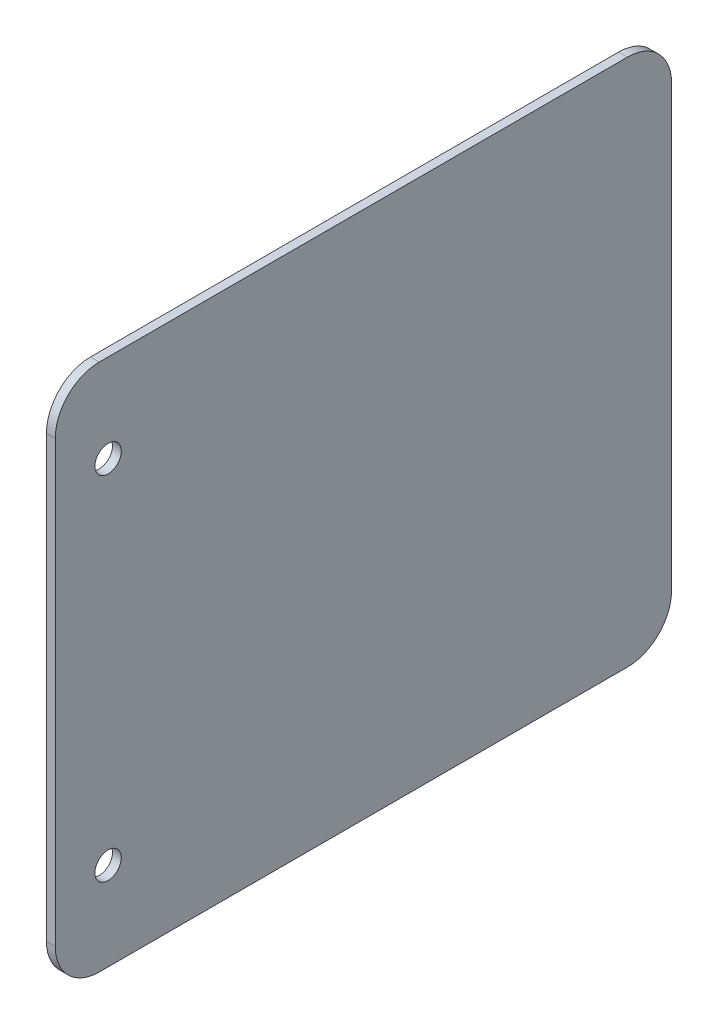
ISO-10303-21;
HEADER;
FILE_DESCRIPTION(('STEP AP214'),'2;1');
FILE_NAME('part.step','',(''),(''),'','','');
FILE_SCHEMA(('AUTOMOTIVE_DESIGN { 1 0 10303 214 1 1 1 1 }'));
ENDSEC;
DATA;
#1=APPLICATION_CONTEXT('core data for automotive mechanical design processes');
#2=APPLICATION_PROTOCOL_DEFINITION('international standard','automotive_design',2000,#1);
#3=PRODUCT_CONTEXT('',#1,'mechanical');
#4=PRODUCT('Part','Part','',(#3));
#5=PRODUCT_RELATED_PRODUCT_CATEGORY('part','',(#4));
#6=PRODUCT_DEFINITION_FORMATION('','',#4);
#7=PRODUCT_DEFINITION_CONTEXT('part definition',#1,'design');
#8=PRODUCT_DEFINITION('design','',#6,#7);
#9=PRODUCT_DEFINITION_SHAPE('','',#8);
#10=(LENGTH_UNIT() NAMED_UNIT(*) SI_UNIT(.MILLI.,.METRE.));
#11=(NAMED_UNIT(*) PLANE_ANGLE_UNIT() SI_UNIT($,.RADIAN.));
#12=(NAMED_UNIT(*) SI_UNIT($,.STERADIAN.) SOLID_ANGLE_UNIT());
#13=UNCERTAINTY_MEASURE_WITH_UNIT(LENGTH_MEASURE(1.E-05),#10,'distance_accuracy_value','');
#14=(GEOMETRIC_REPRESENTATION_CONTEXT(3) GLOBAL_UNCERTAINTY_ASSIGNED_CONTEXT((#13)) GLOBAL_UNIT_ASSIGNED_CONTEXT((#10,
#11,#12)) REPRESENTATION_CONTEXT('',''));
#15=CARTESIAN_POINT('',(0.,0.,0.));
#16=DIRECTION('',(0.,0.,1.));
#17=DIRECTION('',(1.,0.,0.));
#18=AXIS2_PLACEMENT_3D('',#15,#16,#17);
#19=CARTESIAN_POINT('',(-1.,-25.,30.));
#20=DIRECTION('',(1.,0.,0.));
#21=DIRECTION('',(0.,0.,-1.));
#22=AXIS2_PLACEMENT_3D('',#19,#20,#21);
#23=CYLINDRICAL_SURFACE('',#22,5.00000000000001);
#24=CARTESIAN_POINT('',(0.,-25.,30.));
#25=DIRECTION('',(1.,0.,0.));
#26=DIRECTION('',(0.,0.,-1.));
#27=AXIS2_PLACEMENT_3D('',#24,#25,#26);
#28=CIRCLE('',#27,5.00000000000001);
#29=CARTESIAN_POINT('',(0.,-25.,35.));
#30=VERTEX_POINT('',#29);
#31=CARTESIAN_POINT('',(0.,-30.,30.));
#32=VERTEX_POINT('',#31);
#33=EDGE_CURVE('E130',#30,#32,#28,.T.);
#34=ORIENTED_EDGE('',*,*,#33,.F.);
#35=DIRECTION('',(1.,0.,0.));
#36=VECTOR('',#35,1.);
#37=CARTESIAN_POINT('',(-1.,-25.,35.));
#38=LINE('',#37,#36);
#39=CARTESIAN_POINT('',(-1.,-25.,35.));
#40=VERTEX_POINT('',#39);
#41=EDGE_CURVE('E11',#40,#30,#38,.T.);
#42=ORIENTED_EDGE('',*,*,#41,.F.);
#43=CARTESIAN_POINT('',(-1.,-25.,30.));
#44=DIRECTION('',(1.,0.,0.));
#45=DIRECTION('',(0.,0.,-1.));
#46=AXIS2_PLACEMENT_3D('',#43,#44,#45);
#47=CIRCLE('',#46,5.00000000000001);
#48=CARTESIAN_POINT('',(-1.,-30.,30.));
#49=VERTEX_POINT('',#48);
#50=EDGE_CURVE('E151',#40,#49,#47,.T.);
#51=ORIENTED_EDGE('',*,*,#50,.T.);
#52=DIRECTION('',(1.,0.,0.));
#53=VECTOR('',#52,1.);
#54=CARTESIAN_POINT('',(-1.,-30.,30.));
#55=LINE('',#54,#53);
#56=EDGE_CURVE('E36',#49,#32,#55,.T.);
#57=ORIENTED_EDGE('',*,*,#56,.T.);
#58=EDGE_LOOP('',(#34,#42,#51,#57));
#59=FACE_BOUND('',#58,.T.);
#60=ADVANCED_FACE('F33',(#59),#23,.T.);
#61=CARTESIAN_POINT('',(-1.,25.,35.));
#62=DIRECTION('',(0.,0.,1.));
#63=DIRECTION('',(1.,0.,0.));
#64=AXIS2_PLACEMENT_3D('',#61,#62,#63);
#65=PLANE('',#64);
#66=DIRECTION('',(0.,-1.,0.));
#67=VECTOR('',#66,1.);
#68=CARTESIAN_POINT('',(0.,25.,35.));
#69=LINE('',#68,#67);
#70=CARTESIAN_POINT('',(0.,25.,35.));
#71=VERTEX_POINT('',#70);
#72=EDGE_CURVE('E149',#71,#30,#69,.T.);
#73=ORIENTED_EDGE('',*,*,#72,.F.);
#74=DIRECTION('',(1.,0.,0.));
#75=VECTOR('',#74,1.);
#76=CARTESIAN_POINT('',(-1.,25.,35.));
#77=LINE('',#76,#75);
#78=CARTESIAN_POINT('',(-1.,25.,35.));
#79=VERTEX_POINT('',#78);
#80=EDGE_CURVE('E42',#79,#71,#77,.T.);
#81=ORIENTED_EDGE('',*,*,#80,.F.);
#82=DIRECTION('',(0.,-1.,0.));
#83=VECTOR('',#82,1.);
#84=CARTESIAN_POINT('',(-1.,25.,35.));
#85=LINE('',#84,#83);
#86=EDGE_CURVE('E120',#79,#40,#85,.T.);
#87=ORIENTED_EDGE('',*,*,#86,.T.);
#88=ORIENTED_EDGE('',*,*,#41,.T.);
#89=EDGE_LOOP('',(#73,#81,#87,#88));
#90=FACE_BOUND('',#89,.T.);
#91=ADVANCED_FACE('F163',(#90),#65,.T.);
#92=CARTESIAN_POINT('',(-1.,25.,30.));
#93=DIRECTION('',(1.,0.,0.));
#94=DIRECTION('',(0.,0.,-1.));
#95=AXIS2_PLACEMENT_3D('',#92,#93,#94);
#96=CYLINDRICAL_SURFACE('',#95,5.);
#97=CARTESIAN_POINT('',(0.,25.,30.));
#98=DIRECTION('',(1.,0.,0.));
#99=DIRECTION('',(0.,0.,-1.));
#100=AXIS2_PLACEMENT_3D('',#97,#98,#99);
#101=CIRCLE('',#100,5.);
#102=CARTESIAN_POINT('',(0.,30.,30.));
#103=VERTEX_POINT('',#102);
#104=EDGE_CURVE('E107',#103,#71,#101,.T.);
#105=ORIENTED_EDGE('',*,*,#104,.F.);
#106=DIRECTION('',(1.,0.,0.));
#107=VECTOR('',#106,1.);
#108=CARTESIAN_POINT('',(-1.,30.,30.));
#109=LINE('',#108,#107);
#110=CARTESIAN_POINT('',(-1.,30.,30.));
#111=VERTEX_POINT('',#110);
#112=EDGE_CURVE('E102',#111,#103,#109,.T.);
#113=ORIENTED_EDGE('',*,*,#112,.F.);
#114=CARTESIAN_POINT('',(-1.,25.,30.));
#115=DIRECTION('',(1.,0.,0.));
#116=DIRECTION('',(0.,0.,-1.));
#117=AXIS2_PLACEMENT_3D('',#114,#115,#116);
#118=CIRCLE('',#117,5.);
#119=EDGE_CURVE('E105',#111,#79,#118,.T.);
#120=ORIENTED_EDGE('',*,*,#119,.T.);
#121=ORIENTED_EDGE('',*,*,#80,.T.);
#122=EDGE_LOOP('',(#105,#113,#120,#121));
#123=FACE_BOUND('',#122,.T.);
#124=ADVANCED_FACE('F104',(#123),#96,.T.);
#125=CARTESIAN_POINT('',(-1.,30.,30.));
#126=DIRECTION('',(0.,1.,0.));
#127=DIRECTION('',(0.,0.,1.));
#128=AXIS2_PLACEMENT_3D('',#125,#126,#127);
#129=PLANE('',#128);
#130=DIRECTION('',(0.,0.,1.));
#131=VECTOR('',#130,1.);
#132=CARTESIAN_POINT('',(0.,30.,30.));
#133=LINE('',#132,#131);
#134=CARTESIAN_POINT('',(0.,30.,-30.));
#135=VERTEX_POINT('',#134);
#136=EDGE_CURVE('E146',#135,#103,#133,.T.);
#137=ORIENTED_EDGE('',*,*,#136,.F.);
#138=DIRECTION('',(1.,0.,0.));
#139=VECTOR('',#138,1.);
#140=CARTESIAN_POINT('',(-1.,30.,-30.));
#141=LINE('',#140,#139);
#142=CARTESIAN_POINT('',(-1.,30.,-30.));
#143=VERTEX_POINT('',#142);
#144=EDGE_CURVE('E112',#143,#135,#141,.T.);
#145=ORIENTED_EDGE('',*,*,#144,.F.);
#146=DIRECTION('',(0.,0.,1.));
#147=VECTOR('',#146,1.);
#148=CARTESIAN_POINT('',(-1.,30.,30.));
#149=LINE('',#148,#147);
#150=EDGE_CURVE('E118',#143,#111,#149,.T.);
#151=ORIENTED_EDGE('',*,*,#150,.T.);
#152=ORIENTED_EDGE('',*,*,#112,.T.);
#153=EDGE_LOOP('',(#137,#145,#151,#152));
#154=FACE_BOUND('',#153,.T.);
#155=ADVANCED_FACE('F122',(#154),#129,.T.);
#156=CARTESIAN_POINT('',(-1.,25.,-30.));
#157=DIRECTION('',(1.,0.,0.));
#158=DIRECTION('',(0.,0.,-1.));
#159=AXIS2_PLACEMENT_3D('',#156,#157,#158);
#160=CYLINDRICAL_SURFACE('',#159,5.);
#161=CARTESIAN_POINT('',(0.,25.,-30.));
#162=DIRECTION('',(1.,0.,0.));
#163=DIRECTION('',(0.,0.,-1.));
#164=AXIS2_PLACEMENT_3D('',#161,#162,#163);
#165=CIRCLE('',#164,5.);
#166=CARTESIAN_POINT('',(0.,25.,-35.));
#167=VERTEX_POINT('',#166);
#168=EDGE_CURVE('E143',#167,#135,#165,.T.);
#169=ORIENTED_EDGE('',*,*,#168,.F.);
#170=DIRECTION('',(1.,0.,0.));
#171=VECTOR('',#170,1.);
#172=CARTESIAN_POINT('',(-1.,25.,-35.));
#173=LINE('',#172,#171);
#174=CARTESIAN_POINT('',(-1.,25.,-35.));
#175=VERTEX_POINT('',#174);
#176=EDGE_CURVE('E155',#175,#167,#173,.T.);
#177=ORIENTED_EDGE('',*,*,#176,.F.);
#178=CARTESIAN_POINT('',(-1.,25.,-30.));
#179=DIRECTION('',(1.,0.,0.));
#180=DIRECTION('',(0.,0.,-1.));
#181=AXIS2_PLACEMENT_3D('',#178,#179,#180);
#182=CIRCLE('',#181,5.);
#183=EDGE_CURVE('E123',#175,#143,#182,.T.);
#184=ORIENTED_EDGE('',*,*,#183,.T.);
#185=ORIENTED_EDGE('',*,*,#144,.T.);
#186=EDGE_LOOP('',(#169,#177,#184,#185));
#187=FACE_BOUND('',#186,.T.);
#188=ADVANCED_FACE('F176',(#187),#160,.T.);
#189=CARTESIAN_POINT('',(-1.,25.,-35.));
#190=DIRECTION('',(0.,0.,-1.));
#191=DIRECTION('',(0.,1.,0.));
#192=AXIS2_PLACEMENT_3D('',#189,#190,#191);
#193=PLANE('',#192);
#194=DIRECTION('',(0.,1.,0.));
#195=VECTOR('',#194,1.);
#196=CARTESIAN_POINT('',(0.,25.,-35.));
#197=LINE('',#196,#195);
#198=CARTESIAN_POINT('',(0.,-25.,-35.));
#199=VERTEX_POINT('',#198);
#200=EDGE_CURVE('E140',#199,#167,#197,.T.);
#201=ORIENTED_EDGE('',*,*,#200,.F.);
#202=DIRECTION('',(1.,0.,0.));
#203=VECTOR('',#202,1.);
#204=CARTESIAN_POINT('',(-1.,-25.,-35.));
#205=LINE('',#204,#203);
#206=CARTESIAN_POINT('',(-1.,-25.,-35.));
#207=VERTEX_POINT('',#206);
#208=EDGE_CURVE('E157',#207,#199,#205,.T.);
#209=ORIENTED_EDGE('',*,*,#208,.F.);
#210=DIRECTION('',(0.,1.,0.));
#211=VECTOR('',#210,1.);
#212=CARTESIAN_POINT('',(-1.,25.,-35.));
#213=LINE('',#212,#211);
#214=EDGE_CURVE('E125',#207,#175,#213,.T.);
#215=ORIENTED_EDGE('',*,*,#214,.T.);
#216=ORIENTED_EDGE('',*,*,#176,.T.);
#217=EDGE_LOOP('',(#201,#209,#215,#216));
#218=FACE_BOUND('',#217,.T.);
#219=ADVANCED_FACE('F179',(#218),#193,.T.);
#220=CARTESIAN_POINT('',(-1.,-25.,-30.));
#221=DIRECTION('',(1.,0.,0.));
#222=DIRECTION('',(0.,0.,-1.));
#223=AXIS2_PLACEMENT_3D('',#220,#221,#222);
#224=CYLINDRICAL_SURFACE('',#223,5.);
#225=CARTESIAN_POINT('',(0.,-25.,-30.));
#226=DIRECTION('',(1.,0.,0.));
#227=DIRECTION('',(0.,0.,-1.));
#228=AXIS2_PLACEMENT_3D('',#225,#226,#227);
#229=CIRCLE('',#228,5.);
#230=CARTESIAN_POINT('',(0.,-30.,-30.));
#231=VERTEX_POINT('',#230);
#232=EDGE_CURVE('E137',#231,#199,#229,.T.);
#233=ORIENTED_EDGE('',*,*,#232,.F.);
#234=DIRECTION('',(1.,0.,0.));
#235=VECTOR('',#234,1.);
#236=CARTESIAN_POINT('',(-1.,-30.,-30.));
#237=LINE('',#236,#235);
#238=CARTESIAN_POINT('',(-1.,-30.,-30.));
#239=VERTEX_POINT('',#238);
#240=EDGE_CURVE('E158',#239,#231,#237,.T.);
#241=ORIENTED_EDGE('',*,*,#240,.F.);
#242=CARTESIAN_POINT('',(-1.,-25.,-30.));
#243=DIRECTION('',(1.,0.,0.));
#244=DIRECTION('',(0.,0.,-1.));
#245=AXIS2_PLACEMENT_3D('',#242,#243,#244);
#246=CIRCLE('',#245,5.);
#247=EDGE_CURVE('E225',#239,#207,#246,.T.);
#248=ORIENTED_EDGE('',*,*,#247,.T.);
#249=ORIENTED_EDGE('',*,*,#208,.T.);
#250=EDGE_LOOP('',(#233,#241,#248,#249));
#251=FACE_BOUND('',#250,.T.);
#252=ADVANCED_FACE('F183',(#251),#224,.T.);
#253=CARTESIAN_POINT('',(-1.,-30.,30.));
#254=DIRECTION('',(0.,-1.,0.));
#255=DIRECTION('',(0.,0.,-1.));
#256=AXIS2_PLACEMENT_3D('',#253,#254,#255);
#257=PLANE('',#256);
#258=DIRECTION('',(0.,0.,-1.));
#259=VECTOR('',#258,1.);
#260=CARTESIAN_POINT('',(0.,-30.,30.));
#261=LINE('',#260,#259);
#262=EDGE_CURVE('E133',#32,#231,#261,.T.);
#263=ORIENTED_EDGE('',*,*,#262,.F.);
#264=ORIENTED_EDGE('',*,*,#56,.F.);
#265=DIRECTION('',(0.,0.,-1.));
#266=VECTOR('',#265,1.);
#267=CARTESIAN_POINT('',(-1.,-30.,30.));
#268=LINE('',#267,#266);
#269=EDGE_CURVE('E223',#49,#239,#268,.T.);
#270=ORIENTED_EDGE('',*,*,#269,.T.);
#271=ORIENTED_EDGE('',*,*,#240,.T.);
#272=EDGE_LOOP('',(#263,#264,#270,#271));
#273=FACE_BOUND('',#272,.T.);
#274=ADVANCED_FACE('F160',(#273),#257,.T.);
#275=CARTESIAN_POINT('',(-1.,-25.,30.));
#276=DIRECTION('',(1.,0.,0.));
#277=DIRECTION('',(0.,0.,-1.));
#278=AXIS2_PLACEMENT_3D('',#275,#276,#277);
#279=PLANE('',#278);
#280=CARTESIAN_POINT('',(-0.999999999999999,-20.,29.));
#281=DIRECTION('',(1.,0.,0.));
#282=DIRECTION('',(0.,0.,-1.));
#283=AXIS2_PLACEMENT_3D('',#280,#281,#282);
#284=CIRCLE('',#283,1.5);
#285=CARTESIAN_POINT('',(-0.999999999999999,-20.,27.5));
#286=VERTEX_POINT('',#285);
#287=EDGE_CURVE('E213',#286,#286,#284,.T.);
#288=ORIENTED_EDGE('',*,*,#287,.T.);
#289=EDGE_LOOP('',(#288));
#290=FACE_BOUND('',#289,.T.);
#291=CARTESIAN_POINT('',(-0.999999999999999,20.,29.));
#292=DIRECTION('',(1.,0.,0.));
#293=DIRECTION('',(0.,0.,-1.));
#294=AXIS2_PLACEMENT_3D('',#291,#292,#293);
#295=CIRCLE('',#294,1.5);
#296=CARTESIAN_POINT('',(-0.999999999999999,20.,27.5));
#297=VERTEX_POINT('',#296);
#298=EDGE_CURVE('E134',#297,#297,#295,.T.);
#299=ORIENTED_EDGE('',*,*,#298,.T.);
#300=EDGE_LOOP('',(#299));
#301=FACE_BOUND('',#300,.T.);
#302=ORIENTED_EDGE('',*,*,#50,.F.);
#303=ORIENTED_EDGE('',*,*,#86,.F.);
#304=ORIENTED_EDGE('',*,*,#119,.F.);
#305=ORIENTED_EDGE('',*,*,#150,.F.);
#306=ORIENTED_EDGE('',*,*,#183,.F.);
#307=ORIENTED_EDGE('',*,*,#214,.F.);
#308=ORIENTED_EDGE('',*,*,#247,.F.);
#309=ORIENTED_EDGE('',*,*,#269,.F.);
#310=EDGE_LOOP('',(#302,#303,#304,#305,#306,#307,#308,#309));
#311=FACE_BOUND('',#310,.T.);
#312=ADVANCED_FACE('F116',(#290,#301,#311),#279,.F.);
#313=CARTESIAN_POINT('',(0.,-25.,30.));
#314=DIRECTION('',(1.,0.,0.));
#315=DIRECTION('',(0.,0.,-1.));
#316=AXIS2_PLACEMENT_3D('',#313,#314,#315);
#317=PLANE('',#316);
#318=CARTESIAN_POINT('',(0.,-20.,29.));
#319=DIRECTION('',(1.,0.,0.));
#320=DIRECTION('',(0.,0.,-1.));
#321=AXIS2_PLACEMENT_3D('',#318,#319,#320);
#322=CIRCLE('',#321,1.5);
#323=CARTESIAN_POINT('',(0.,-20.,27.5));
#324=VERTEX_POINT('',#323);
#325=EDGE_CURVE('E211',#324,#324,#322,.T.);
#326=ORIENTED_EDGE('',*,*,#325,.F.);
#327=EDGE_LOOP('',(#326));
#328=FACE_BOUND('',#327,.T.);
#329=CARTESIAN_POINT('',(0.,20.,29.));
#330=DIRECTION('',(1.,0.,0.));
#331=DIRECTION('',(0.,0.,-1.));
#332=AXIS2_PLACEMENT_3D('',#329,#330,#331);
#333=CIRCLE('',#332,1.5);
#334=CARTESIAN_POINT('',(0.,20.,27.5));
#335=VERTEX_POINT('',#334);
#336=EDGE_CURVE('E214',#335,#335,#333,.T.);
#337=ORIENTED_EDGE('',*,*,#336,.F.);
#338=EDGE_LOOP('',(#337));
#339=FACE_BOUND('',#338,.T.);
#340=ORIENTED_EDGE('',*,*,#33,.T.);
#341=ORIENTED_EDGE('',*,*,#262,.T.);
#342=ORIENTED_EDGE('',*,*,#232,.T.);
#343=ORIENTED_EDGE('',*,*,#200,.T.);
#344=ORIENTED_EDGE('',*,*,#168,.T.);
#345=ORIENTED_EDGE('',*,*,#136,.T.);
#346=ORIENTED_EDGE('',*,*,#104,.T.);
#347=ORIENTED_EDGE('',*,*,#72,.T.);
#348=EDGE_LOOP('',(#340,#341,#342,#343,#344,#345,#346,#347));
#349=FACE_BOUND('',#348,.T.);
#350=ADVANCED_FACE('F162',(#328,#339,#349),#317,.T.);
#351=CARTESIAN_POINT('',(-10.,20.,29.));
#352=DIRECTION('',(1.,0.,0.));
#353=DIRECTION('',(0.,0.,-1.));
#354=AXIS2_PLACEMENT_3D('',#351,#352,#353);
#355=CYLINDRICAL_SURFACE('',#354,1.5);
#356=ORIENTED_EDGE('',*,*,#336,.T.);
#357=EDGE_LOOP('',(#356));
#358=FACE_BOUND('',#357,.T.);
#359=ORIENTED_EDGE('',*,*,#298,.F.);
#360=EDGE_LOOP('',(#359));
#361=FACE_BOUND('',#360,.T.);
#362=ADVANCED_FACE('F195',(#358,#361),#355,.F.);
#363=CARTESIAN_POINT('',(-10.,-20.,29.));
#364=DIRECTION('',(1.,0.,0.));
#365=DIRECTION('',(0.,0.,-1.));
#366=AXIS2_PLACEMENT_3D('',#363,#364,#365);
#367=CYLINDRICAL_SURFACE('',#366,1.5);
#368=ORIENTED_EDGE('',*,*,#325,.T.);
#369=EDGE_LOOP('',(#368));
#370=FACE_BOUND('',#369,.T.);
#371=ORIENTED_EDGE('',*,*,#287,.F.);
#372=EDGE_LOOP('',(#371));
#373=FACE_BOUND('',#372,.T.);
#374=ADVANCED_FACE('F202',(#370,#373),#367,.F.);
#375=CLOSED_SHELL('',(#60,#91,#124,#155,#188,#219,#252,#274,#312,#350,#362,#374));
#376=MANIFOLD_SOLID_BREP('B2',#375);
#377=ADVANCED_BREP_SHAPE_REPRESENTATION('',(#18,#376),#14);
#378=SHAPE_DEFINITION_REPRESENTATION(#9,#377);
ENDSEC;
END-ISO-10303-21;
